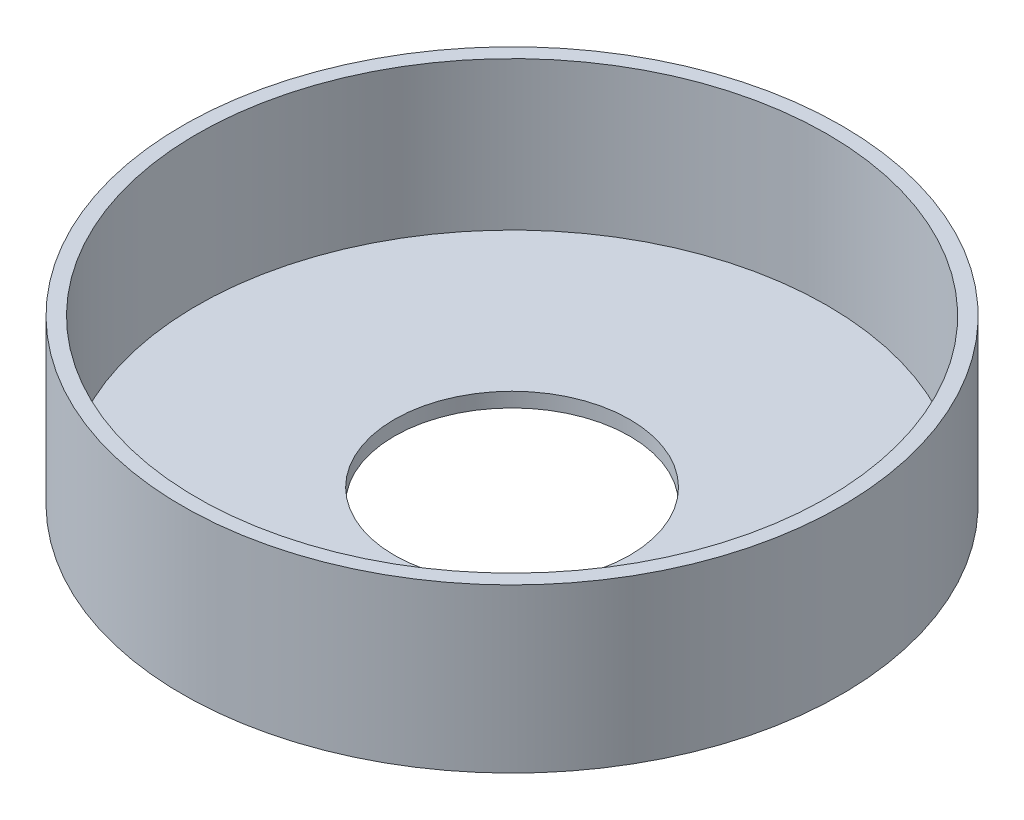
ISO-10303-21;
HEADER;
FILE_DESCRIPTION(('STEP AP214'),'2;1');
FILE_NAME('part.step','',(''),(''),'','','');
FILE_SCHEMA(('AUTOMOTIVE_DESIGN { 1 0 10303 214 1 1 1 1 }'));
ENDSEC;
DATA;
#1=APPLICATION_CONTEXT('core data for automotive mechanical design processes');
#2=APPLICATION_PROTOCOL_DEFINITION('international standard','automotive_design',2000,#1);
#3=PRODUCT_CONTEXT('',#1,'mechanical');
#4=PRODUCT('Part','Part','',(#3));
#5=PRODUCT_RELATED_PRODUCT_CATEGORY('part','',(#4));
#6=PRODUCT_DEFINITION_FORMATION('','',#4);
#7=PRODUCT_DEFINITION_CONTEXT('part definition',#1,'design');
#8=PRODUCT_DEFINITION('design','',#6,#7);
#9=PRODUCT_DEFINITION_SHAPE('','',#8);
#10=(LENGTH_UNIT() NAMED_UNIT(*) SI_UNIT(.MILLI.,.METRE.));
#11=(NAMED_UNIT(*) PLANE_ANGLE_UNIT() SI_UNIT($,.RADIAN.));
#12=(NAMED_UNIT(*) SI_UNIT($,.STERADIAN.) SOLID_ANGLE_UNIT());
#13=UNCERTAINTY_MEASURE_WITH_UNIT(LENGTH_MEASURE(1.E-05),#10,'distance_accuracy_value','');
#14=(GEOMETRIC_REPRESENTATION_CONTEXT(3) GLOBAL_UNCERTAINTY_ASSIGNED_CONTEXT((#13)) GLOBAL_UNIT_ASSIGNED_CONTEXT((#10,
#11,#12)) REPRESENTATION_CONTEXT('',''));
#15=CARTESIAN_POINT('',(0.,0.,0.));
#16=DIRECTION('',(0.,0.,1.));
#17=DIRECTION('',(1.,0.,0.));
#18=AXIS2_PLACEMENT_3D('',#15,#16,#17);
#19=CARTESIAN_POINT('',(0.,0.,0.));
#20=DIRECTION('',(0.,-1.,0.));
#21=DIRECTION('',(0.,0.,-1.));
#22=AXIS2_PLACEMENT_3D('',#19,#20,#21);
#23=CYLINDRICAL_SURFACE('',#22,9.1);
#24=CARTESIAN_POINT('',(0.,4.5,0.));
#25=DIRECTION('',(0.,-1.,0.));
#26=DIRECTION('',(0.,0.,-1.));
#27=AXIS2_PLACEMENT_3D('',#24,#25,#26);
#28=CIRCLE('',#27,9.1);
#29=CARTESIAN_POINT('',(0.,4.5,-9.1));
#30=VERTEX_POINT('',#29);
#31=EDGE_CURVE('E52',#30,#30,#28,.T.);
#32=ORIENTED_EDGE('',*,*,#31,.T.);
#33=EDGE_LOOP('',(#32));
#34=FACE_BOUND('',#33,.T.);
#35=CARTESIAN_POINT('',(0.,0.,0.));
#36=DIRECTION('',(0.,-1.,0.));
#37=DIRECTION('',(0.,0.,-1.));
#38=AXIS2_PLACEMENT_3D('',#35,#36,#37);
#39=CIRCLE('',#38,9.1);
#40=CARTESIAN_POINT('',(0.,0.,-9.1));
#41=VERTEX_POINT('',#40);
#42=EDGE_CURVE('E10',#41,#41,#39,.T.);
#43=ORIENTED_EDGE('',*,*,#42,.F.);
#44=EDGE_LOOP('',(#43));
#45=FACE_BOUND('',#44,.T.);
#46=ADVANCED_FACE('F30',(#34,#45),#23,.T.);
#47=CARTESIAN_POINT('',(3.25,0.,0.));
#48=DIRECTION('',(0.,-1.,0.));
#49=DIRECTION('',(0.,0.,-1.));
#50=AXIS2_PLACEMENT_3D('',#47,#48,#49);
#51=PLANE('',#50);
#52=ORIENTED_EDGE('',*,*,#42,.T.);
#53=EDGE_LOOP('',(#52));
#54=FACE_BOUND('',#53,.T.);
#55=CARTESIAN_POINT('',(0.,0.,0.));
#56=DIRECTION('',(0.,-1.,0.));
#57=DIRECTION('',(0.,0.,-1.));
#58=AXIS2_PLACEMENT_3D('',#55,#56,#57);
#59=CIRCLE('',#58,3.25);
#60=CARTESIAN_POINT('',(0.,0.,-3.25));
#61=VERTEX_POINT('',#60);
#62=EDGE_CURVE('E36',#61,#61,#59,.T.);
#63=ORIENTED_EDGE('',*,*,#62,.F.);
#64=EDGE_LOOP('',(#63));
#65=FACE_BOUND('',#64,.T.);
#66=ADVANCED_FACE('F70',(#54,#65),#51,.T.);
#67=CARTESIAN_POINT('',(0.,0.,0.));
#68=DIRECTION('',(0.,-1.,0.));
#69=DIRECTION('',(0.,0.,-1.));
#70=AXIS2_PLACEMENT_3D('',#67,#68,#69);
#71=CYLINDRICAL_SURFACE('',#70,3.25);
#72=ORIENTED_EDGE('',*,*,#62,.T.);
#73=EDGE_LOOP('',(#72));
#74=FACE_BOUND('',#73,.T.);
#75=CARTESIAN_POINT('',(0.,0.4,0.));
#76=DIRECTION('',(0.,-1.,0.));
#77=DIRECTION('',(0.,0.,-1.));
#78=AXIS2_PLACEMENT_3D('',#75,#76,#77);
#79=CIRCLE('',#78,3.25);
#80=CARTESIAN_POINT('',(0.,0.4,-3.25));
#81=VERTEX_POINT('',#80);
#82=EDGE_CURVE('E40',#81,#81,#79,.T.);
#83=ORIENTED_EDGE('',*,*,#82,.F.);
#84=EDGE_LOOP('',(#83));
#85=FACE_BOUND('',#84,.T.);
#86=ADVANCED_FACE('F74',(#74,#85),#71,.F.);
#87=CARTESIAN_POINT('',(3.25,0.4,0.));
#88=DIRECTION('',(0.,1.,0.));
#89=DIRECTION('',(0.,0.,1.));
#90=AXIS2_PLACEMENT_3D('',#87,#88,#89);
#91=PLANE('',#90);
#92=ORIENTED_EDGE('',*,*,#82,.T.);
#93=EDGE_LOOP('',(#92));
#94=FACE_BOUND('',#93,.T.);
#95=CARTESIAN_POINT('',(0.,0.4,0.));
#96=DIRECTION('',(0.,-1.,0.));
#97=DIRECTION('',(0.,0.,-1.));
#98=AXIS2_PLACEMENT_3D('',#95,#96,#97);
#99=CIRCLE('',#98,8.7);
#100=CARTESIAN_POINT('',(0.,0.4,-8.7));
#101=VERTEX_POINT('',#100);
#102=EDGE_CURVE('E44',#101,#101,#99,.T.);
#103=ORIENTED_EDGE('',*,*,#102,.F.);
#104=EDGE_LOOP('',(#103));
#105=FACE_BOUND('',#104,.T.);
#106=ADVANCED_FACE('F66',(#94,#105),#91,.T.);
#107=CARTESIAN_POINT('',(0.,0.,0.));
#108=DIRECTION('',(0.,-1.,0.));
#109=DIRECTION('',(0.,0.,-1.));
#110=AXIS2_PLACEMENT_3D('',#107,#108,#109);
#111=CYLINDRICAL_SURFACE('',#110,8.7);
#112=ORIENTED_EDGE('',*,*,#102,.T.);
#113=EDGE_LOOP('',(#112));
#114=FACE_BOUND('',#113,.T.);
#115=CARTESIAN_POINT('',(0.,4.5,0.));
#116=DIRECTION('',(0.,-1.,0.));
#117=DIRECTION('',(0.,0.,-1.));
#118=AXIS2_PLACEMENT_3D('',#115,#116,#117);
#119=CIRCLE('',#118,8.7);
#120=CARTESIAN_POINT('',(0.,4.5,-8.7));
#121=VERTEX_POINT('',#120);
#122=EDGE_CURVE('E49',#121,#121,#119,.T.);
#123=ORIENTED_EDGE('',*,*,#122,.F.);
#124=EDGE_LOOP('',(#123));
#125=FACE_BOUND('',#124,.T.);
#126=ADVANCED_FACE('F60',(#114,#125),#111,.F.);
#127=CARTESIAN_POINT('',(8.7,4.5,0.));
#128=DIRECTION('',(0.,1.,0.));
#129=DIRECTION('',(0.,0.,1.));
#130=AXIS2_PLACEMENT_3D('',#127,#128,#129);
#131=PLANE('',#130);
#132=ORIENTED_EDGE('',*,*,#122,.T.);
#133=EDGE_LOOP('',(#132));
#134=FACE_BOUND('',#133,.T.);
#135=ORIENTED_EDGE('',*,*,#31,.F.);
#136=EDGE_LOOP('',(#135));
#137=FACE_BOUND('',#136,.T.);
#138=ADVANCED_FACE('F58',(#134,#137),#131,.T.);
#139=CLOSED_SHELL('',(#46,#66,#86,#106,#126,#138));
#140=MANIFOLD_SOLID_BREP('B2',#139);
#141=ADVANCED_BREP_SHAPE_REPRESENTATION('',(#18,#140),#14);
#142=SHAPE_DEFINITION_REPRESENTATION(#9,#141);
ENDSEC;
END-ISO-10303-21;
